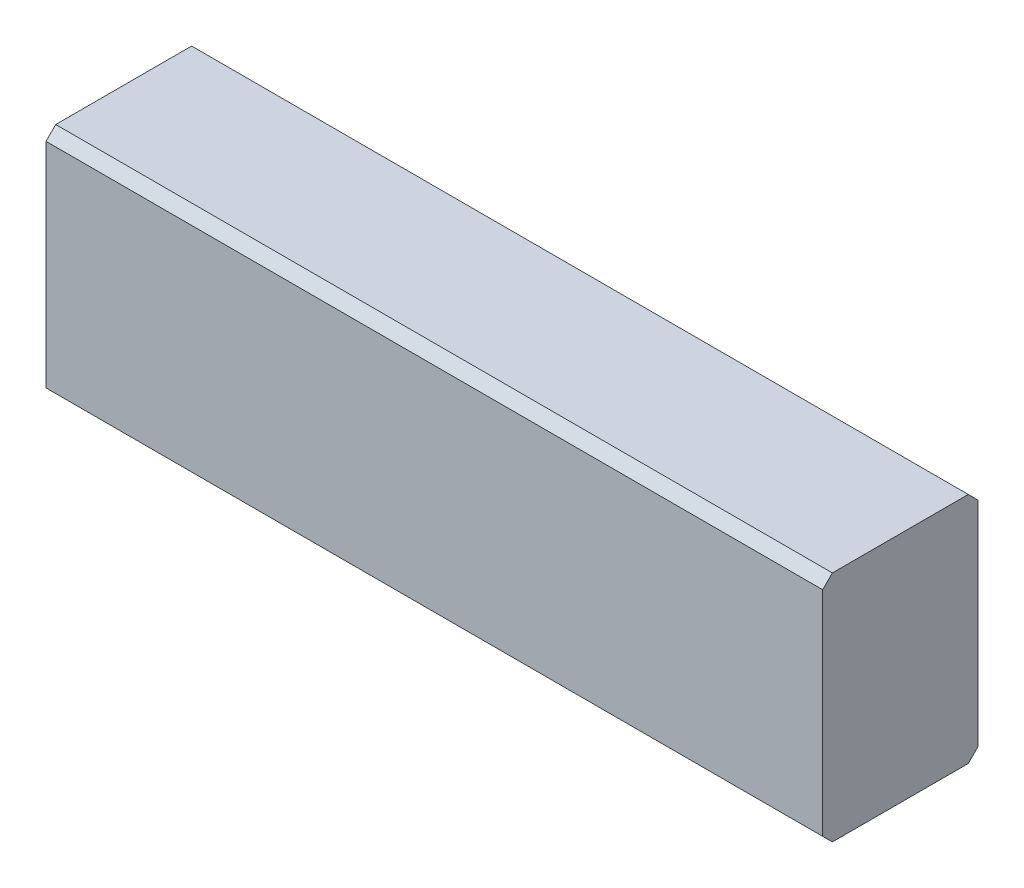
ISO-10303-21;
HEADER;
FILE_DESCRIPTION(('STEP AP214'),'2;1');
FILE_NAME('part.step','',(''),(''),'','','');
FILE_SCHEMA(('AUTOMOTIVE_DESIGN { 1 0 10303 214 1 1 1 1 }'));
ENDSEC;
DATA;
#1=APPLICATION_CONTEXT('core data for automotive mechanical design processes');
#2=APPLICATION_PROTOCOL_DEFINITION('international standard','automotive_design',2000,#1);
#3=PRODUCT_CONTEXT('',#1,'mechanical');
#4=PRODUCT('Part','Part','',(#3));
#5=PRODUCT_RELATED_PRODUCT_CATEGORY('part','',(#4));
#6=PRODUCT_DEFINITION_FORMATION('','',#4);
#7=PRODUCT_DEFINITION_CONTEXT('part definition',#1,'design');
#8=PRODUCT_DEFINITION('design','',#6,#7);
#9=PRODUCT_DEFINITION_SHAPE('','',#8);
#10=(LENGTH_UNIT() NAMED_UNIT(*) SI_UNIT(.MILLI.,.METRE.));
#11=(NAMED_UNIT(*) PLANE_ANGLE_UNIT() SI_UNIT($,.RADIAN.));
#12=(NAMED_UNIT(*) SI_UNIT($,.STERADIAN.) SOLID_ANGLE_UNIT());
#13=UNCERTAINTY_MEASURE_WITH_UNIT(LENGTH_MEASURE(1.E-05),#10,'distance_accuracy_value','');
#14=(GEOMETRIC_REPRESENTATION_CONTEXT(3) GLOBAL_UNCERTAINTY_ASSIGNED_CONTEXT((#13)) GLOBAL_UNIT_ASSIGNED_CONTEXT((#10,
#11,#12)) REPRESENTATION_CONTEXT('',''));
#15=CARTESIAN_POINT('',(0.,0.,0.));
#16=DIRECTION('',(0.,0.,1.));
#17=DIRECTION('',(1.,0.,0.));
#18=AXIS2_PLACEMENT_3D('',#15,#16,#17);
#19=CARTESIAN_POINT('',(3.,3.,4.));
#20=DIRECTION('',(-1.,0.,0.));
#21=DIRECTION('',(0.,0.,1.));
#22=AXIS2_PLACEMENT_3D('',#19,#20,#21);
#23=PLANE('',#22);
#24=DIRECTION('',(0.,1.,0.));
#25=VECTOR('',#24,1.);
#26=CARTESIAN_POINT('',(3.,3.,0.));
#27=LINE('',#26,#25);
#28=CARTESIAN_POINT('',(3.,-2.75,0.));
#29=VERTEX_POINT('',#28);
#30=CARTESIAN_POINT('',(3.,2.74999999999999,0.));
#31=VERTEX_POINT('',#30);
#32=EDGE_CURVE('E191',#29,#31,#27,.T.);
#33=ORIENTED_EDGE('',*,*,#32,.T.);
#34=DIRECTION('',(0.,-0.707106781186553,-0.707106781186542));
#35=VECTOR('',#34,1.);
#36=CARTESIAN_POINT('',(3.,3.,0.25));
#37=LINE('',#36,#35);
#38=CARTESIAN_POINT('',(3.,3.,0.25));
#39=VERTEX_POINT('',#38);
#40=EDGE_CURVE('E171',#31,#39,#37,.F.);
#41=ORIENTED_EDGE('',*,*,#40,.T.);
#42=DIRECTION('',(0.,0.,-1.));
#43=VECTOR('',#42,1.);
#44=CARTESIAN_POINT('',(3.,3.,4.));
#45=LINE('',#44,#43);
#46=CARTESIAN_POINT('',(3.,3.,3.75));
#47=VERTEX_POINT('',#46);
#48=EDGE_CURVE('E135',#47,#39,#45,.T.);
#49=ORIENTED_EDGE('',*,*,#48,.F.);
#50=DIRECTION('',(0.,-0.707106781186546,0.707106781186549));
#51=VECTOR('',#50,1.);
#52=CARTESIAN_POINT('',(3.,2.75,4.));
#53=LINE('',#52,#51);
#54=CARTESIAN_POINT('',(3.,2.75,4.));
#55=VERTEX_POINT('',#54);
#56=EDGE_CURVE('E140',#47,#55,#53,.T.);
#57=ORIENTED_EDGE('',*,*,#56,.T.);
#58=DIRECTION('',(0.,1.,0.));
#59=VECTOR('',#58,1.);
#60=CARTESIAN_POINT('',(3.,3.,4.));
#61=LINE('',#60,#59);
#62=CARTESIAN_POINT('',(3.,-2.75,4.));
#63=VERTEX_POINT('',#62);
#64=EDGE_CURVE('E136',#63,#55,#61,.T.);
#65=ORIENTED_EDGE('',*,*,#64,.F.);
#66=DIRECTION('',(0.,-0.707106781186543,-0.707106781186552));
#67=VECTOR('',#66,1.);
#68=CARTESIAN_POINT('',(3.,-2.75,4.));
#69=LINE('',#68,#67);
#70=CARTESIAN_POINT('',(3.,-3.,3.75));
#71=VERTEX_POINT('',#70);
#72=EDGE_CURVE('E69',#63,#71,#69,.T.);
#73=ORIENTED_EDGE('',*,*,#72,.T.);
#74=DIRECTION('',(0.,0.,-1.));
#75=VECTOR('',#74,1.);
#76=CARTESIAN_POINT('',(3.,-3.,4.));
#77=LINE('',#76,#75);
#78=CARTESIAN_POINT('',(3.,-3.,0.25));
#79=VERTEX_POINT('',#78);
#80=EDGE_CURVE('E148',#71,#79,#77,.T.);
#81=ORIENTED_EDGE('',*,*,#80,.T.);
#82=DIRECTION('',(0.,-0.707106781186552,0.707106781186543));
#83=VECTOR('',#82,1.);
#84=CARTESIAN_POINT('',(3.,-3.,0.249999999999998));
#85=LINE('',#84,#83);
#86=EDGE_CURVE('E61',#79,#29,#85,.F.);
#87=ORIENTED_EDGE('',*,*,#86,.T.);
#88=EDGE_LOOP('',(#33,#41,#49,#57,#65,#73,#81,#87));
#89=FACE_BOUND('',#88,.T.);
#90=ADVANCED_FACE('F45',(#89),#23,.F.);
#91=CARTESIAN_POINT('',(0.,3.,4.));
#92=DIRECTION('',(0.,-1.,0.));
#93=DIRECTION('',(1.,0.,0.));
#94=AXIS2_PLACEMENT_3D('',#91,#92,#93);
#95=PLANE('',#94);
#96=ORIENTED_EDGE('',*,*,#48,.T.);
#97=DIRECTION('',(-1.,0.,0.));
#98=VECTOR('',#97,1.);
#99=CARTESIAN_POINT('',(0.,3.,0.25));
#100=LINE('',#99,#98);
#101=CARTESIAN_POINT('',(-17.,3.,0.25));
#102=VERTEX_POINT('',#101);
#103=EDGE_CURVE('E133',#39,#102,#100,.T.);
#104=ORIENTED_EDGE('',*,*,#103,.T.);
#105=DIRECTION('',(0.,0.,-1.));
#106=VECTOR('',#105,1.);
#107=CARTESIAN_POINT('',(-17.,3.,4.));
#108=LINE('',#107,#106);
#109=CARTESIAN_POINT('',(-17.,3.,3.75));
#110=VERTEX_POINT('',#109);
#111=EDGE_CURVE('E116',#110,#102,#108,.T.);
#112=ORIENTED_EDGE('',*,*,#111,.F.);
#113=DIRECTION('',(1.,0.,0.));
#114=VECTOR('',#113,1.);
#115=CARTESIAN_POINT('',(3.,3.,3.75));
#116=LINE('',#115,#114);
#117=EDGE_CURVE('E130',#110,#47,#116,.T.);
#118=ORIENTED_EDGE('',*,*,#117,.T.);
#119=EDGE_LOOP('',(#96,#104,#112,#118));
#120=FACE_BOUND('',#119,.T.);
#121=ADVANCED_FACE('F129',(#120),#95,.F.);
#122=CARTESIAN_POINT('',(-14.,-3.,4.));
#123=DIRECTION('',(0.,1.,0.));
#124=DIRECTION('',(-1.,0.,0.));
#125=AXIS2_PLACEMENT_3D('',#122,#123,#124);
#126=PLANE('',#125);
#127=DIRECTION('',(0.,0.,-1.));
#128=VECTOR('',#127,1.);
#129=CARTESIAN_POINT('',(-17.,-3.,4.));
#130=LINE('',#129,#128);
#131=CARTESIAN_POINT('',(-17.,-3.,3.75));
#132=VERTEX_POINT('',#131);
#133=CARTESIAN_POINT('',(-17.,-3.,0.25));
#134=VERTEX_POINT('',#133);
#135=EDGE_CURVE('E142',#132,#134,#130,.T.);
#136=ORIENTED_EDGE('',*,*,#135,.T.);
#137=DIRECTION('',(1.,0.,0.));
#138=VECTOR('',#137,1.);
#139=CARTESIAN_POINT('',(-14.,-3.,0.25));
#140=LINE('',#139,#138);
#141=EDGE_CURVE('E177',#134,#79,#140,.T.);
#142=ORIENTED_EDGE('',*,*,#141,.T.);
#143=ORIENTED_EDGE('',*,*,#80,.F.);
#144=DIRECTION('',(-1.,0.,0.));
#145=VECTOR('',#144,1.);
#146=CARTESIAN_POINT('',(-17.,-3.,3.75));
#147=LINE('',#146,#145);
#148=EDGE_CURVE('E174',#71,#132,#147,.T.);
#149=ORIENTED_EDGE('',*,*,#148,.T.);
#150=EDGE_LOOP('',(#136,#142,#143,#149));
#151=FACE_BOUND('',#150,.T.);
#152=ADVANCED_FACE('F205',(#151),#126,.F.);
#153=CARTESIAN_POINT('',(0.,0.,4.));
#154=DIRECTION('',(0.,0.,1.));
#155=DIRECTION('',(1.,0.,0.));
#156=AXIS2_PLACEMENT_3D('',#153,#154,#155);
#157=PLANE('',#156);
#158=ORIENTED_EDGE('',*,*,#64,.T.);
#159=DIRECTION('',(-1.,0.,0.));
#160=VECTOR('',#159,1.);
#161=CARTESIAN_POINT('',(-17.,2.75,4.));
#162=LINE('',#161,#160);
#163=CARTESIAN_POINT('',(-17.,2.75,4.));
#164=VERTEX_POINT('',#163);
#165=EDGE_CURVE('E11',#55,#164,#162,.T.);
#166=ORIENTED_EDGE('',*,*,#165,.T.);
#167=DIRECTION('',(0.,-1.,0.));
#168=VECTOR('',#167,1.);
#169=CARTESIAN_POINT('',(-17.,3.,4.));
#170=LINE('',#169,#168);
#171=CARTESIAN_POINT('',(-17.,-2.75,4.));
#172=VERTEX_POINT('',#171);
#173=EDGE_CURVE('E118',#164,#172,#170,.T.);
#174=ORIENTED_EDGE('',*,*,#173,.T.);
#175=DIRECTION('',(1.,0.,0.));
#176=VECTOR('',#175,1.);
#177=CARTESIAN_POINT('',(3.,-2.75,4.));
#178=LINE('',#177,#176);
#179=EDGE_CURVE('E54',#172,#63,#178,.T.);
#180=ORIENTED_EDGE('',*,*,#179,.T.);
#181=EDGE_LOOP('',(#158,#166,#174,#180));
#182=FACE_BOUND('',#181,.T.);
#183=ADVANCED_FACE('F184',(#182),#157,.T.);
#184=CARTESIAN_POINT('',(0.,0.,0.));
#185=DIRECTION('',(0.,0.,1.));
#186=DIRECTION('',(1.,0.,0.));
#187=AXIS2_PLACEMENT_3D('',#184,#185,#186);
#188=PLANE('',#187);
#189=DIRECTION('',(0.,-1.,0.));
#190=VECTOR('',#189,1.);
#191=CARTESIAN_POINT('',(-17.,3.,0.));
#192=LINE('',#191,#190);
#193=CARTESIAN_POINT('',(-17.,2.75,0.));
#194=VERTEX_POINT('',#193);
#195=CARTESIAN_POINT('',(-17.,-2.75,0.));
#196=VERTEX_POINT('',#195);
#197=EDGE_CURVE('E194',#194,#196,#192,.T.);
#198=ORIENTED_EDGE('',*,*,#197,.F.);
#199=DIRECTION('',(1.,0.,0.));
#200=VECTOR('',#199,1.);
#201=CARTESIAN_POINT('',(0.,2.74999999999999,0.));
#202=LINE('',#201,#200);
#203=EDGE_CURVE('E162',#194,#31,#202,.T.);
#204=ORIENTED_EDGE('',*,*,#203,.T.);
#205=ORIENTED_EDGE('',*,*,#32,.F.);
#206=DIRECTION('',(-1.,0.,0.));
#207=VECTOR('',#206,1.);
#208=CARTESIAN_POINT('',(0.,-2.75,0.));
#209=LINE('',#208,#207);
#210=EDGE_CURVE('E159',#29,#196,#209,.T.);
#211=ORIENTED_EDGE('',*,*,#210,.T.);
#212=EDGE_LOOP('',(#198,#204,#205,#211));
#213=FACE_BOUND('',#212,.T.);
#214=ADVANCED_FACE('F211',(#213),#188,.F.);
#215=CARTESIAN_POINT('',(-17.,3.,4.));
#216=DIRECTION('',(1.,0.,0.));
#217=DIRECTION('',(0.,1.,0.));
#218=AXIS2_PLACEMENT_3D('',#215,#216,#217);
#219=PLANE('',#218);
#220=ORIENTED_EDGE('',*,*,#111,.T.);
#221=DIRECTION('',(0.,0.707106781186553,0.707106781186542));
#222=VECTOR('',#221,1.);
#223=CARTESIAN_POINT('',(-17.,3.,0.250000000000004));
#224=LINE('',#223,#222);
#225=EDGE_CURVE('E156',#102,#194,#224,.F.);
#226=ORIENTED_EDGE('',*,*,#225,.T.);
#227=ORIENTED_EDGE('',*,*,#197,.T.);
#228=DIRECTION('',(0.,0.707106781186552,-0.707106781186543));
#229=VECTOR('',#228,1.);
#230=CARTESIAN_POINT('',(-17.,-3.,0.25));
#231=LINE('',#230,#229);
#232=EDGE_CURVE('E123',#196,#134,#231,.F.);
#233=ORIENTED_EDGE('',*,*,#232,.T.);
#234=ORIENTED_EDGE('',*,*,#135,.F.);
#235=DIRECTION('',(0.,0.707106781186543,0.707106781186552));
#236=VECTOR('',#235,1.);
#237=CARTESIAN_POINT('',(-17.,-2.75,4.));
#238=LINE('',#237,#236);
#239=EDGE_CURVE('E124',#132,#172,#238,.T.);
#240=ORIENTED_EDGE('',*,*,#239,.T.);
#241=ORIENTED_EDGE('',*,*,#173,.F.);
#242=DIRECTION('',(0.,0.707106781186546,-0.707106781186549));
#243=VECTOR('',#242,1.);
#244=CARTESIAN_POINT('',(-17.,2.75,4.));
#245=LINE('',#244,#243);
#246=EDGE_CURVE('E113',#164,#110,#245,.T.);
#247=ORIENTED_EDGE('',*,*,#246,.T.);
#248=EDGE_LOOP('',(#220,#226,#227,#233,#234,#240,#241,#247));
#249=FACE_BOUND('',#248,.T.);
#250=ADVANCED_FACE('F115',(#249),#219,.F.);
#251=CARTESIAN_POINT('',(0.,3.,0.25));
#252=DIRECTION('',(0.,-0.707106781186542,0.707106781186553));
#253=DIRECTION('',(0.,-0.707106781186553,-0.707106781186542));
#254=AXIS2_PLACEMENT_3D('',#251,#252,#253);
#255=PLANE('',#254);
#256=ORIENTED_EDGE('',*,*,#40,.F.);
#257=ORIENTED_EDGE('',*,*,#203,.F.);
#258=ORIENTED_EDGE('',*,*,#225,.F.);
#259=ORIENTED_EDGE('',*,*,#103,.F.);
#260=EDGE_LOOP('',(#256,#257,#258,#259));
#261=FACE_BOUND('',#260,.T.);
#262=ADVANCED_FACE('F215',(#261),#255,.F.);
#263=CARTESIAN_POINT('',(-14.,-3.,0.25));
#264=DIRECTION('',(0.,0.707106781186542,0.707106781186552));
#265=DIRECTION('',(0.,-0.707106781186552,0.707106781186543));
#266=AXIS2_PLACEMENT_3D('',#263,#264,#265);
#267=PLANE('',#266);
#268=ORIENTED_EDGE('',*,*,#232,.F.);
#269=ORIENTED_EDGE('',*,*,#210,.F.);
#270=ORIENTED_EDGE('',*,*,#86,.F.);
#271=ORIENTED_EDGE('',*,*,#141,.F.);
#272=EDGE_LOOP('',(#268,#269,#270,#271));
#273=FACE_BOUND('',#272,.T.);
#274=ADVANCED_FACE('F208',(#273),#267,.F.);
#275=CARTESIAN_POINT('',(0.,2.75,4.));
#276=DIRECTION('',(0.,0.707106781186549,0.707106781186546));
#277=DIRECTION('',(0.,-0.707106781186546,0.707106781186549));
#278=AXIS2_PLACEMENT_3D('',#275,#276,#277);
#279=PLANE('',#278);
#280=ORIENTED_EDGE('',*,*,#56,.F.);
#281=ORIENTED_EDGE('',*,*,#117,.F.);
#282=ORIENTED_EDGE('',*,*,#246,.F.);
#283=ORIENTED_EDGE('',*,*,#165,.F.);
#284=EDGE_LOOP('',(#280,#281,#282,#283));
#285=FACE_BOUND('',#284,.T.);
#286=ADVANCED_FACE('F139',(#285),#279,.T.);
#287=CARTESIAN_POINT('',(0.,-2.75,4.));
#288=DIRECTION('',(0.,-0.707106781186552,0.707106781186542));
#289=DIRECTION('',(0.,-0.707106781186543,-0.707106781186552));
#290=AXIS2_PLACEMENT_3D('',#287,#288,#289);
#291=PLANE('',#290);
#292=ORIENTED_EDGE('',*,*,#239,.F.);
#293=ORIENTED_EDGE('',*,*,#148,.F.);
#294=ORIENTED_EDGE('',*,*,#72,.F.);
#295=ORIENTED_EDGE('',*,*,#179,.F.);
#296=EDGE_LOOP('',(#292,#293,#294,#295));
#297=FACE_BOUND('',#296,.T.);
#298=ADVANCED_FACE('F47',(#297),#291,.T.);
#299=CLOSED_SHELL('',(#90,#121,#152,#183,#214,#250,#262,#274,#286,#298));
#300=MANIFOLD_SOLID_BREP('B2',#299);
#301=ADVANCED_BREP_SHAPE_REPRESENTATION('',(#18,#300),#14);
#302=SHAPE_DEFINITION_REPRESENTATION(#9,#301);
ENDSEC;
END-ISO-10303-21;
